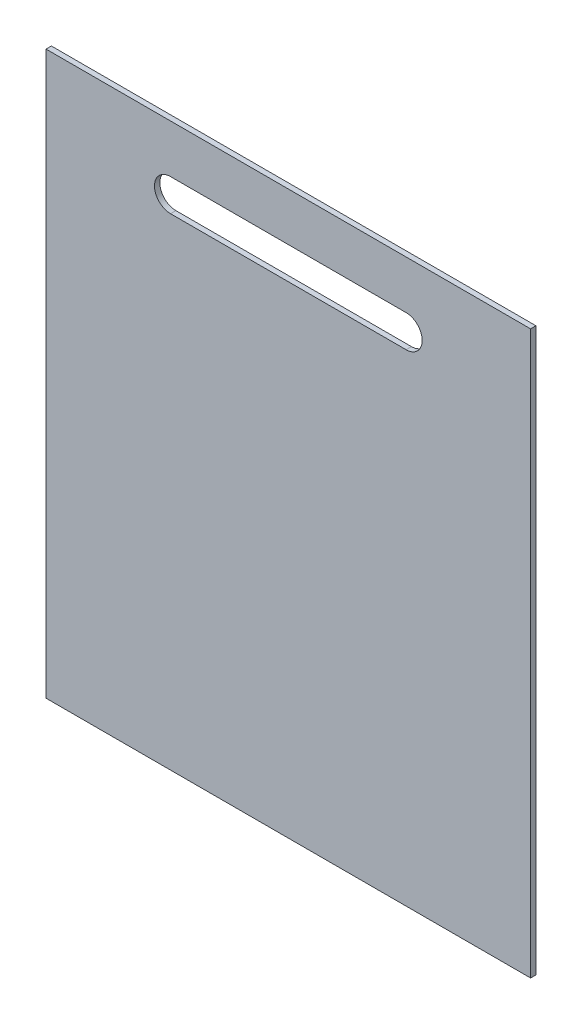
ISO-10303-21;
HEADER;
FILE_DESCRIPTION(('STEP AP214'),'2;1');
FILE_NAME('part.step','',(''),(''),'','','');
FILE_SCHEMA(('AUTOMOTIVE_DESIGN { 1 0 10303 214 1 1 1 1 }'));
ENDSEC;
DATA;
#1=APPLICATION_CONTEXT('core data for automotive mechanical design processes');
#2=APPLICATION_PROTOCOL_DEFINITION('international standard','automotive_design',2000,#1);
#3=PRODUCT_CONTEXT('',#1,'mechanical');
#4=PRODUCT('Part','Part','',(#3));
#5=PRODUCT_RELATED_PRODUCT_CATEGORY('part','',(#4));
#6=PRODUCT_DEFINITION_FORMATION('','',#4);
#7=PRODUCT_DEFINITION_CONTEXT('part definition',#1,'design');
#8=PRODUCT_DEFINITION('design','',#6,#7);
#9=PRODUCT_DEFINITION_SHAPE('','',#8);
#10=(LENGTH_UNIT() NAMED_UNIT(*) SI_UNIT(.MILLI.,.METRE.));
#11=(NAMED_UNIT(*) PLANE_ANGLE_UNIT() SI_UNIT($,.RADIAN.));
#12=(NAMED_UNIT(*) SI_UNIT($,.STERADIAN.) SOLID_ANGLE_UNIT());
#13=UNCERTAINTY_MEASURE_WITH_UNIT(LENGTH_MEASURE(1.E-05),#10,'distance_accuracy_value','');
#14=(GEOMETRIC_REPRESENTATION_CONTEXT(3) GLOBAL_UNCERTAINTY_ASSIGNED_CONTEXT((#13)) GLOBAL_UNIT_ASSIGNED_CONTEXT((#10,
#11,#12)) REPRESENTATION_CONTEXT('',''));
#15=CARTESIAN_POINT('',(0.,0.,0.));
#16=DIRECTION('',(0.,0.,1.));
#17=DIRECTION('',(1.,0.,0.));
#18=AXIS2_PLACEMENT_3D('',#15,#16,#17);
#19=CARTESIAN_POINT('',(0.,0.,5.));
#20=DIRECTION('',(0.,0.,-1.));
#21=DIRECTION('',(-1.,0.,0.));
#22=AXIS2_PLACEMENT_3D('',#19,#20,#21);
#23=PLANE('',#22);
#24=DIRECTION('',(0.,1.,0.));
#25=VECTOR('',#24,1.);
#26=CARTESIAN_POINT('',(226.25,-262.5,5.));
#27=LINE('',#26,#25);
#28=CARTESIAN_POINT('',(226.25,-262.5,5.));
#29=VERTEX_POINT('',#28);
#30=CARTESIAN_POINT('',(226.25,262.5,5.));
#31=VERTEX_POINT('',#30);
#32=EDGE_CURVE('E153',#29,#31,#27,.T.);
#33=ORIENTED_EDGE('',*,*,#32,.T.);
#34=DIRECTION('',(-1.,0.,0.));
#35=VECTOR('',#34,1.);
#36=CARTESIAN_POINT('',(-226.25,262.5,5.));
#37=LINE('',#36,#35);
#38=CARTESIAN_POINT('',(-226.25,262.5,5.));
#39=VERTEX_POINT('',#38);
#40=EDGE_CURVE('E157',#31,#39,#37,.T.);
#41=ORIENTED_EDGE('',*,*,#40,.T.);
#42=DIRECTION('',(0.,-1.,0.));
#43=VECTOR('',#42,1.);
#44=CARTESIAN_POINT('',(-226.25,-262.5,5.));
#45=LINE('',#44,#43);
#46=CARTESIAN_POINT('',(-226.25,-262.5,5.));
#47=VERTEX_POINT('',#46);
#48=EDGE_CURVE('E161',#39,#47,#45,.T.);
#49=ORIENTED_EDGE('',*,*,#48,.T.);
#50=DIRECTION('',(1.,0.,0.));
#51=VECTOR('',#50,1.);
#52=CARTESIAN_POINT('',(-226.25,-262.5,5.));
#53=LINE('',#52,#51);
#54=EDGE_CURVE('E164',#47,#29,#53,.T.);
#55=ORIENTED_EDGE('',*,*,#54,.T.);
#56=EDGE_LOOP('',(#33,#41,#49,#55));
#57=FACE_BOUND('',#56,.T.);
#58=CARTESIAN_POINT('',(-110.,202.5,5.));
#59=DIRECTION('',(0.,0.,1.));
#60=DIRECTION('',(1.,0.,0.));
#61=AXIS2_PLACEMENT_3D('',#58,#59,#60);
#62=CIRCLE('',#61,15.);
#63=CARTESIAN_POINT('',(-110.,217.5,5.));
#64=VERTEX_POINT('',#63);
#65=CARTESIAN_POINT('',(-110.,187.5,5.));
#66=VERTEX_POINT('',#65);
#67=EDGE_CURVE('E105',#64,#66,#62,.T.);
#68=ORIENTED_EDGE('',*,*,#67,.F.);
#69=DIRECTION('',(-1.,0.,0.));
#70=VECTOR('',#69,1.);
#71=CARTESIAN_POINT('',(-110.,217.5,5.));
#72=LINE('',#71,#70);
#73=CARTESIAN_POINT('',(110.,217.5,5.));
#74=VERTEX_POINT('',#73);
#75=EDGE_CURVE('E131',#74,#64,#72,.T.);
#76=ORIENTED_EDGE('',*,*,#75,.F.);
#77=CARTESIAN_POINT('',(110.,202.5,5.));
#78=DIRECTION('',(0.,0.,1.));
#79=DIRECTION('',(1.,0.,0.));
#80=AXIS2_PLACEMENT_3D('',#77,#78,#79);
#81=CIRCLE('',#80,15.);
#82=CARTESIAN_POINT('',(110.,187.5,5.));
#83=VERTEX_POINT('',#82);
#84=EDGE_CURVE('E127',#83,#74,#81,.T.);
#85=ORIENTED_EDGE('',*,*,#84,.F.);
#86=DIRECTION('',(1.,0.,0.));
#87=VECTOR('',#86,1.);
#88=CARTESIAN_POINT('',(-110.,187.5,5.));
#89=LINE('',#88,#87);
#90=EDGE_CURVE('E114',#66,#83,#89,.T.);
#91=ORIENTED_EDGE('',*,*,#90,.F.);
#92=EDGE_LOOP('',(#68,#76,#85,#91));
#93=FACE_BOUND('',#92,.T.);
#94=ADVANCED_FACE('F39',(#57,#93),#23,.F.);
#95=CARTESIAN_POINT('',(0.,0.,0.));
#96=DIRECTION('',(0.,0.,-1.));
#97=DIRECTION('',(-1.,0.,0.));
#98=AXIS2_PLACEMENT_3D('',#95,#96,#97);
#99=PLANE('',#98);
#100=DIRECTION('',(0.,1.,0.));
#101=VECTOR('',#100,1.);
#102=CARTESIAN_POINT('',(226.25,-262.5,0.));
#103=LINE('',#102,#101);
#104=CARTESIAN_POINT('',(226.25,-262.5,0.));
#105=VERTEX_POINT('',#104);
#106=CARTESIAN_POINT('',(226.25,262.5,0.));
#107=VERTEX_POINT('',#106);
#108=EDGE_CURVE('E123',#105,#107,#103,.T.);
#109=ORIENTED_EDGE('',*,*,#108,.F.);
#110=DIRECTION('',(1.,0.,0.));
#111=VECTOR('',#110,1.);
#112=CARTESIAN_POINT('',(-226.25,-262.5,0.));
#113=LINE('',#112,#111);
#114=CARTESIAN_POINT('',(-226.25,-262.5,0.));
#115=VERTEX_POINT('',#114);
#116=EDGE_CURVE('E158',#115,#105,#113,.T.);
#117=ORIENTED_EDGE('',*,*,#116,.F.);
#118=DIRECTION('',(0.,-1.,0.));
#119=VECTOR('',#118,1.);
#120=CARTESIAN_POINT('',(-226.25,-262.5,0.));
#121=LINE('',#120,#119);
#122=CARTESIAN_POINT('',(-226.25,262.5,0.));
#123=VERTEX_POINT('',#122);
#124=EDGE_CURVE('E174',#123,#115,#121,.T.);
#125=ORIENTED_EDGE('',*,*,#124,.F.);
#126=DIRECTION('',(-1.,0.,0.));
#127=VECTOR('',#126,1.);
#128=CARTESIAN_POINT('',(-226.25,262.5,0.));
#129=LINE('',#128,#127);
#130=EDGE_CURVE('E171',#107,#123,#129,.T.);
#131=ORIENTED_EDGE('',*,*,#130,.F.);
#132=EDGE_LOOP('',(#109,#117,#125,#131));
#133=FACE_BOUND('',#132,.T.);
#134=DIRECTION('',(-1.,0.,0.));
#135=VECTOR('',#134,1.);
#136=CARTESIAN_POINT('',(-110.,217.5,0.));
#137=LINE('',#136,#135);
#138=CARTESIAN_POINT('',(110.,217.5,0.));
#139=VERTEX_POINT('',#138);
#140=CARTESIAN_POINT('',(-110.,217.5,0.));
#141=VERTEX_POINT('',#140);
#142=EDGE_CURVE('E115',#139,#141,#137,.T.);
#143=ORIENTED_EDGE('',*,*,#142,.T.);
#144=CARTESIAN_POINT('',(-110.,202.5,0.));
#145=DIRECTION('',(0.,0.,1.));
#146=DIRECTION('',(1.,0.,0.));
#147=AXIS2_PLACEMENT_3D('',#144,#145,#146);
#148=CIRCLE('',#147,15.);
#149=CARTESIAN_POINT('',(-110.,187.5,0.));
#150=VERTEX_POINT('',#149);
#151=EDGE_CURVE('E63',#141,#150,#148,.T.);
#152=ORIENTED_EDGE('',*,*,#151,.T.);
#153=DIRECTION('',(1.,0.,0.));
#154=VECTOR('',#153,1.);
#155=CARTESIAN_POINT('',(-110.,187.5,0.));
#156=LINE('',#155,#154);
#157=CARTESIAN_POINT('',(110.,187.5,0.));
#158=VERTEX_POINT('',#157);
#159=EDGE_CURVE('E121',#150,#158,#156,.T.);
#160=ORIENTED_EDGE('',*,*,#159,.T.);
#161=CARTESIAN_POINT('',(110.,202.5,0.));
#162=DIRECTION('',(0.,0.,1.));
#163=DIRECTION('',(1.,0.,0.));
#164=AXIS2_PLACEMENT_3D('',#161,#162,#163);
#165=CIRCLE('',#164,15.);
#166=EDGE_CURVE('E140',#158,#139,#165,.T.);
#167=ORIENTED_EDGE('',*,*,#166,.T.);
#168=EDGE_LOOP('',(#143,#152,#160,#167));
#169=FACE_BOUND('',#168,.T.);
#170=ADVANCED_FACE('F197',(#133,#169),#99,.T.);
#171=CARTESIAN_POINT('',(226.25,-262.5,5.));
#172=DIRECTION('',(-1.,0.,0.));
#173=DIRECTION('',(0.,0.,1.));
#174=AXIS2_PLACEMENT_3D('',#171,#172,#173);
#175=PLANE('',#174);
#176=ORIENTED_EDGE('',*,*,#108,.T.);
#177=DIRECTION('',(0.,0.,-1.));
#178=VECTOR('',#177,1.);
#179=CARTESIAN_POINT('',(226.25,262.5,5.));
#180=LINE('',#179,#178);
#181=EDGE_CURVE('E11',#31,#107,#180,.T.);
#182=ORIENTED_EDGE('',*,*,#181,.F.);
#183=ORIENTED_EDGE('',*,*,#32,.F.);
#184=DIRECTION('',(0.,0.,-1.));
#185=VECTOR('',#184,1.);
#186=CARTESIAN_POINT('',(226.25,-262.5,5.));
#187=LINE('',#186,#185);
#188=EDGE_CURVE('E167',#29,#105,#187,.T.);
#189=ORIENTED_EDGE('',*,*,#188,.T.);
#190=EDGE_LOOP('',(#176,#182,#183,#189));
#191=FACE_BOUND('',#190,.T.);
#192=ADVANCED_FACE('F41',(#191),#175,.F.);
#193=CARTESIAN_POINT('',(-226.25,262.5,5.));
#194=DIRECTION('',(0.,-1.,0.));
#195=DIRECTION('',(0.,0.,-1.));
#196=AXIS2_PLACEMENT_3D('',#193,#194,#195);
#197=PLANE('',#196);
#198=ORIENTED_EDGE('',*,*,#130,.T.);
#199=DIRECTION('',(0.,0.,-1.));
#200=VECTOR('',#199,1.);
#201=CARTESIAN_POINT('',(-226.25,262.5,5.));
#202=LINE('',#201,#200);
#203=EDGE_CURVE('E48',#39,#123,#202,.T.);
#204=ORIENTED_EDGE('',*,*,#203,.F.);
#205=ORIENTED_EDGE('',*,*,#40,.F.);
#206=ORIENTED_EDGE('',*,*,#181,.T.);
#207=EDGE_LOOP('',(#198,#204,#205,#206));
#208=FACE_BOUND('',#207,.T.);
#209=ADVANCED_FACE('F207',(#208),#197,.F.);
#210=CARTESIAN_POINT('',(-226.25,-262.5,5.));
#211=DIRECTION('',(1.,0.,0.));
#212=DIRECTION('',(0.,0.,-1.));
#213=AXIS2_PLACEMENT_3D('',#210,#211,#212);
#214=PLANE('',#213);
#215=ORIENTED_EDGE('',*,*,#124,.T.);
#216=DIRECTION('',(0.,0.,-1.));
#217=VECTOR('',#216,1.);
#218=CARTESIAN_POINT('',(-226.25,-262.5,5.));
#219=LINE('',#218,#217);
#220=EDGE_CURVE('E182',#47,#115,#219,.T.);
#221=ORIENTED_EDGE('',*,*,#220,.F.);
#222=ORIENTED_EDGE('',*,*,#48,.F.);
#223=ORIENTED_EDGE('',*,*,#203,.T.);
#224=EDGE_LOOP('',(#215,#221,#222,#223));
#225=FACE_BOUND('',#224,.T.);
#226=ADVANCED_FACE('F191',(#225),#214,.F.);
#227=CARTESIAN_POINT('',(-226.25,-262.5,5.));
#228=DIRECTION('',(0.,1.,0.));
#229=DIRECTION('',(0.,0.,1.));
#230=AXIS2_PLACEMENT_3D('',#227,#228,#229);
#231=PLANE('',#230);
#232=ORIENTED_EDGE('',*,*,#116,.T.);
#233=ORIENTED_EDGE('',*,*,#188,.F.);
#234=ORIENTED_EDGE('',*,*,#54,.F.);
#235=ORIENTED_EDGE('',*,*,#220,.T.);
#236=EDGE_LOOP('',(#232,#233,#234,#235));
#237=FACE_BOUND('',#236,.T.);
#238=ADVANCED_FACE('F201',(#237),#231,.F.);
#239=CARTESIAN_POINT('',(-110.,202.5,5.));
#240=DIRECTION('',(0.,0.,-1.));
#241=DIRECTION('',(-1.,0.,0.));
#242=AXIS2_PLACEMENT_3D('',#239,#240,#241);
#243=CYLINDRICAL_SURFACE('',#242,15.);
#244=ORIENTED_EDGE('',*,*,#151,.F.);
#245=DIRECTION('',(0.,0.,-1.));
#246=VECTOR('',#245,1.);
#247=CARTESIAN_POINT('',(-110.,217.5,5.));
#248=LINE('',#247,#246);
#249=EDGE_CURVE('E109',#64,#141,#248,.T.);
#250=ORIENTED_EDGE('',*,*,#249,.F.);
#251=ORIENTED_EDGE('',*,*,#67,.T.);
#252=DIRECTION('',(0.,0.,-1.));
#253=VECTOR('',#252,1.);
#254=CARTESIAN_POINT('',(-110.,187.5,5.));
#255=LINE('',#254,#253);
#256=EDGE_CURVE('E108',#66,#150,#255,.T.);
#257=ORIENTED_EDGE('',*,*,#256,.T.);
#258=EDGE_LOOP('',(#244,#250,#251,#257));
#259=FACE_BOUND('',#258,.T.);
#260=ADVANCED_FACE('F107',(#259),#243,.F.);
#261=CARTESIAN_POINT('',(-110.,187.5,5.));
#262=DIRECTION('',(0.,1.,0.));
#263=DIRECTION('',(0.,0.,1.));
#264=AXIS2_PLACEMENT_3D('',#261,#262,#263);
#265=PLANE('',#264);
#266=ORIENTED_EDGE('',*,*,#159,.F.);
#267=ORIENTED_EDGE('',*,*,#256,.F.);
#268=ORIENTED_EDGE('',*,*,#90,.T.);
#269=DIRECTION('',(0.,0.,-1.));
#270=VECTOR('',#269,1.);
#271=CARTESIAN_POINT('',(110.,187.5,5.));
#272=LINE('',#271,#270);
#273=EDGE_CURVE('E124',#83,#158,#272,.T.);
#274=ORIENTED_EDGE('',*,*,#273,.T.);
#275=EDGE_LOOP('',(#266,#267,#268,#274));
#276=FACE_BOUND('',#275,.T.);
#277=ADVANCED_FACE('F118',(#276),#265,.T.);
#278=CARTESIAN_POINT('',(110.,202.5,5.));
#279=DIRECTION('',(0.,0.,-1.));
#280=DIRECTION('',(-1.,0.,0.));
#281=AXIS2_PLACEMENT_3D('',#278,#279,#280);
#282=CYLINDRICAL_SURFACE('',#281,15.);
#283=ORIENTED_EDGE('',*,*,#166,.F.);
#284=ORIENTED_EDGE('',*,*,#273,.F.);
#285=ORIENTED_EDGE('',*,*,#84,.T.);
#286=DIRECTION('',(0.,0.,-1.));
#287=VECTOR('',#286,1.);
#288=CARTESIAN_POINT('',(110.,217.5,5.));
#289=LINE('',#288,#287);
#290=EDGE_CURVE('E55',#74,#139,#289,.T.);
#291=ORIENTED_EDGE('',*,*,#290,.T.);
#292=EDGE_LOOP('',(#283,#284,#285,#291));
#293=FACE_BOUND('',#292,.T.);
#294=ADVANCED_FACE('F230',(#293),#282,.F.);
#295=CARTESIAN_POINT('',(-110.,217.5,5.));
#296=DIRECTION('',(0.,-1.,0.));
#297=DIRECTION('',(0.,0.,-1.));
#298=AXIS2_PLACEMENT_3D('',#295,#296,#297);
#299=PLANE('',#298);
#300=ORIENTED_EDGE('',*,*,#142,.F.);
#301=ORIENTED_EDGE('',*,*,#290,.F.);
#302=ORIENTED_EDGE('',*,*,#75,.T.);
#303=ORIENTED_EDGE('',*,*,#249,.T.);
#304=EDGE_LOOP('',(#300,#301,#302,#303));
#305=FACE_BOUND('',#304,.T.);
#306=ADVANCED_FACE('F234',(#305),#299,.T.);
#307=CLOSED_SHELL('',(#94,#170,#192,#209,#226,#238,#260,#277,#294,#306));
#308=MANIFOLD_SOLID_BREP('B2',#307);
#309=ADVANCED_BREP_SHAPE_REPRESENTATION('',(#18,#308),#14);
#310=SHAPE_DEFINITION_REPRESENTATION(#9,#309);
ENDSEC;
END-ISO-10303-21;
